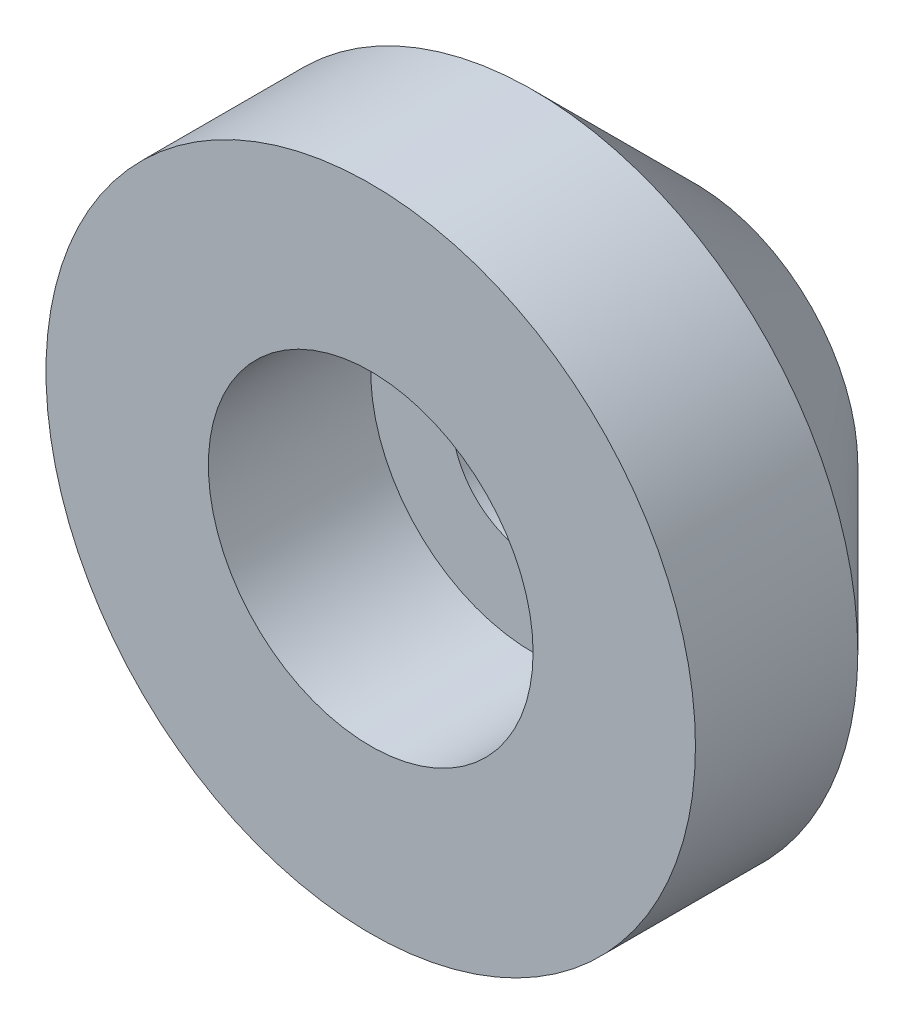
ISO-10303-21;
HEADER;
FILE_DESCRIPTION(('STEP AP214'),'2;1');
FILE_NAME('part.step','',(''),(''),'','','');
FILE_SCHEMA(('AUTOMOTIVE_DESIGN { 1 0 10303 214 1 1 1 1 }'));
ENDSEC;
DATA;
#1=APPLICATION_CONTEXT('core data for automotive mechanical design processes');
#2=APPLICATION_PROTOCOL_DEFINITION('international standard','automotive_design',2000,#1);
#3=PRODUCT_CONTEXT('',#1,'mechanical');
#4=PRODUCT('Part','Part','',(#3));
#5=PRODUCT_RELATED_PRODUCT_CATEGORY('part','',(#4));
#6=PRODUCT_DEFINITION_FORMATION('','',#4);
#7=PRODUCT_DEFINITION_CONTEXT('part definition',#1,'design');
#8=PRODUCT_DEFINITION('design','',#6,#7);
#9=PRODUCT_DEFINITION_SHAPE('','',#8);
#10=(LENGTH_UNIT() NAMED_UNIT(*) SI_UNIT(.MILLI.,.METRE.));
#11=(NAMED_UNIT(*) PLANE_ANGLE_UNIT() SI_UNIT($,.RADIAN.));
#12=(NAMED_UNIT(*) SI_UNIT($,.STERADIAN.) SOLID_ANGLE_UNIT());
#13=UNCERTAINTY_MEASURE_WITH_UNIT(LENGTH_MEASURE(1.E-05),#10,'distance_accuracy_value','');
#14=(GEOMETRIC_REPRESENTATION_CONTEXT(3) GLOBAL_UNCERTAINTY_ASSIGNED_CONTEXT((#13)) GLOBAL_UNIT_ASSIGNED_CONTEXT((#10,
#11,#12)) REPRESENTATION_CONTEXT('',''));
#15=CARTESIAN_POINT('',(0.,0.,0.));
#16=DIRECTION('',(0.,0.,1.));
#17=DIRECTION('',(1.,0.,0.));
#18=AXIS2_PLACEMENT_3D('',#15,#16,#17);
#19=CARTESIAN_POINT('',(0.,0.,5.));
#20=DIRECTION('',(0.,0.,-1.));
#21=DIRECTION('',(-1.,0.,0.));
#22=AXIS2_PLACEMENT_3D('',#19,#20,#21);
#23=CYLINDRICAL_SURFACE('',#22,5.);
#24=CARTESIAN_POINT('',(0.,0.,2.5));
#25=DIRECTION('',(0.,0.,1.));
#26=DIRECTION('',(1.,0.,0.));
#27=AXIS2_PLACEMENT_3D('',#24,#25,#26);
#28=CIRCLE('',#27,5.);
#29=CARTESIAN_POINT('',(5.,0.,2.5));
#30=VERTEX_POINT('',#29);
#31=EDGE_CURVE('E41',#30,#30,#28,.T.);
#32=ORIENTED_EDGE('',*,*,#31,.T.);
#33=EDGE_LOOP('',(#32));
#34=FACE_BOUND('',#33,.T.);
#35=CARTESIAN_POINT('',(0.,0.,5.));
#36=DIRECTION('',(0.,0.,1.));
#37=DIRECTION('',(1.,0.,0.));
#38=AXIS2_PLACEMENT_3D('',#35,#36,#37);
#39=CIRCLE('',#38,5.);
#40=CARTESIAN_POINT('',(5.,0.,5.));
#41=VERTEX_POINT('',#40);
#42=EDGE_CURVE('E45',#41,#41,#39,.T.);
#43=ORIENTED_EDGE('',*,*,#42,.F.);
#44=EDGE_LOOP('',(#43));
#45=FACE_BOUND('',#44,.T.);
#46=ADVANCED_FACE('F33',(#34,#45),#23,.T.);
#47=CARTESIAN_POINT('',(0.,0.,5.));
#48=DIRECTION('',(0.,0.,1.));
#49=DIRECTION('',(1.,0.,0.));
#50=AXIS2_PLACEMENT_3D('',#47,#48,#49);
#51=PLANE('',#50);
#52=CARTESIAN_POINT('',(0.,0.,5.));
#53=DIRECTION('',(0.,0.,1.));
#54=DIRECTION('',(1.,0.,0.));
#55=AXIS2_PLACEMENT_3D('',#52,#53,#54);
#56=CIRCLE('',#55,2.5);
#57=CARTESIAN_POINT('',(2.5,0.,5.));
#58=VERTEX_POINT('',#57);
#59=EDGE_CURVE('E54',#58,#58,#56,.T.);
#60=ORIENTED_EDGE('',*,*,#59,.F.);
#61=EDGE_LOOP('',(#60));
#62=FACE_BOUND('',#61,.T.);
#63=ORIENTED_EDGE('',*,*,#42,.T.);
#64=EDGE_LOOP('',(#63));
#65=FACE_BOUND('',#64,.T.);
#66=ADVANCED_FACE('F69',(#62,#65),#51,.T.);
#67=CARTESIAN_POINT('',(0.,0.,0.));
#68=DIRECTION('',(0.,0.,1.));
#69=DIRECTION('',(1.,0.,0.));
#70=AXIS2_PLACEMENT_3D('',#67,#68,#69);
#71=PLANE('',#70);
#72=CARTESIAN_POINT('',(0.,0.,0.));
#73=DIRECTION('',(0.,0.,1.));
#74=DIRECTION('',(1.,0.,0.));
#75=AXIS2_PLACEMENT_3D('',#72,#73,#74);
#76=CIRCLE('',#75,2.49999999999999);
#77=CARTESIAN_POINT('',(2.49999999999999,0.,0.));
#78=VERTEX_POINT('',#77);
#79=EDGE_CURVE('E10',#78,#78,#76,.F.);
#80=ORIENTED_EDGE('',*,*,#79,.T.);
#81=EDGE_LOOP('',(#80));
#82=FACE_BOUND('',#81,.T.);
#83=CARTESIAN_POINT('',(0.,0.,0.));
#84=DIRECTION('',(0.,0.,-1.));
#85=DIRECTION('',(-1.,0.,0.));
#86=AXIS2_PLACEMENT_3D('',#83,#84,#85);
#87=CIRCLE('',#86,1.25);
#88=CARTESIAN_POINT('',(-1.25,0.,0.));
#89=VERTEX_POINT('',#88);
#90=EDGE_CURVE('E55',#89,#89,#87,.T.);
#91=ORIENTED_EDGE('',*,*,#90,.F.);
#92=EDGE_LOOP('',(#91));
#93=FACE_BOUND('',#92,.T.);
#94=ADVANCED_FACE('F66',(#82,#93),#71,.F.);
#95=CARTESIAN_POINT('',(0.,0.,2.5));
#96=DIRECTION('',(0.,0.,1.));
#97=DIRECTION('',(1.,0.,0.));
#98=AXIS2_PLACEMENT_3D('',#95,#96,#97);
#99=CYLINDRICAL_SURFACE('',#98,2.5);
#100=CARTESIAN_POINT('',(0.,0.,2.5));
#101=DIRECTION('',(0.,0.,1.));
#102=DIRECTION('',(1.,0.,0.));
#103=AXIS2_PLACEMENT_3D('',#100,#101,#102);
#104=CIRCLE('',#103,2.5);
#105=CARTESIAN_POINT('',(2.5,0.,2.5));
#106=VERTEX_POINT('',#105);
#107=EDGE_CURVE('E49',#106,#106,#104,.T.);
#108=ORIENTED_EDGE('',*,*,#107,.F.);
#109=EDGE_LOOP('',(#108));
#110=FACE_BOUND('',#109,.T.);
#111=ORIENTED_EDGE('',*,*,#59,.T.);
#112=EDGE_LOOP('',(#111));
#113=FACE_BOUND('',#112,.T.);
#114=ADVANCED_FACE('F68',(#110,#113),#99,.F.);
#115=CARTESIAN_POINT('',(0.,0.,2.5));
#116=DIRECTION('',(0.,0.,1.));
#117=DIRECTION('',(1.,0.,0.));
#118=AXIS2_PLACEMENT_3D('',#115,#116,#117);
#119=PLANE('',#118);
#120=CARTESIAN_POINT('',(0.,0.,2.5));
#121=DIRECTION('',(0.,0.,1.));
#122=DIRECTION('',(1.,0.,0.));
#123=AXIS2_PLACEMENT_3D('',#120,#121,#122);
#124=CIRCLE('',#123,1.25);
#125=CARTESIAN_POINT('',(1.25,0.,2.5));
#126=VERTEX_POINT('',#125);
#127=EDGE_CURVE('E52',#126,#126,#124,.T.);
#128=ORIENTED_EDGE('',*,*,#127,.F.);
#129=EDGE_LOOP('',(#128));
#130=FACE_BOUND('',#129,.T.);
#131=ORIENTED_EDGE('',*,*,#107,.T.);
#132=EDGE_LOOP('',(#131));
#133=FACE_BOUND('',#132,.T.);
#134=ADVANCED_FACE('F75',(#130,#133),#119,.T.);
#135=CARTESIAN_POINT('',(0.,0.,5.));
#136=DIRECTION('',(0.,0.,-1.));
#137=DIRECTION('',(-1.,0.,0.));
#138=AXIS2_PLACEMENT_3D('',#135,#136,#137);
#139=CYLINDRICAL_SURFACE('',#138,1.25);
#140=ORIENTED_EDGE('',*,*,#127,.T.);
#141=EDGE_LOOP('',(#140));
#142=FACE_BOUND('',#141,.T.);
#143=ORIENTED_EDGE('',*,*,#90,.T.);
#144=EDGE_LOOP('',(#143));
#145=FACE_BOUND('',#144,.T.);
#146=ADVANCED_FACE('F64',(#142,#145),#139,.F.);
#147=CARTESIAN_POINT('',(0.,0.,2.5));
#148=DIRECTION('',(0.,0.,1.));
#149=DIRECTION('',(1.,0.,0.));
#150=AXIS2_PLACEMENT_3D('',#147,#148,#149);
#151=CONICAL_SURFACE('',#150,5.,0.78539816339745);
#152=ORIENTED_EDGE('',*,*,#79,.F.);
#153=EDGE_LOOP('',(#152));
#154=FACE_BOUND('',#153,.T.);
#155=ORIENTED_EDGE('',*,*,#31,.F.);
#156=EDGE_LOOP('',(#155));
#157=FACE_BOUND('',#156,.T.);
#158=ADVANCED_FACE('F36',(#154,#157),#151,.T.);
#159=CLOSED_SHELL('',(#46,#66,#94,#114,#134,#146,#158));
#160=MANIFOLD_SOLID_BREP('B2',#159);
#161=ADVANCED_BREP_SHAPE_REPRESENTATION('',(#18,#160),#14);
#162=SHAPE_DEFINITION_REPRESENTATION(#9,#161);
ENDSEC;
END-ISO-10303-21;
